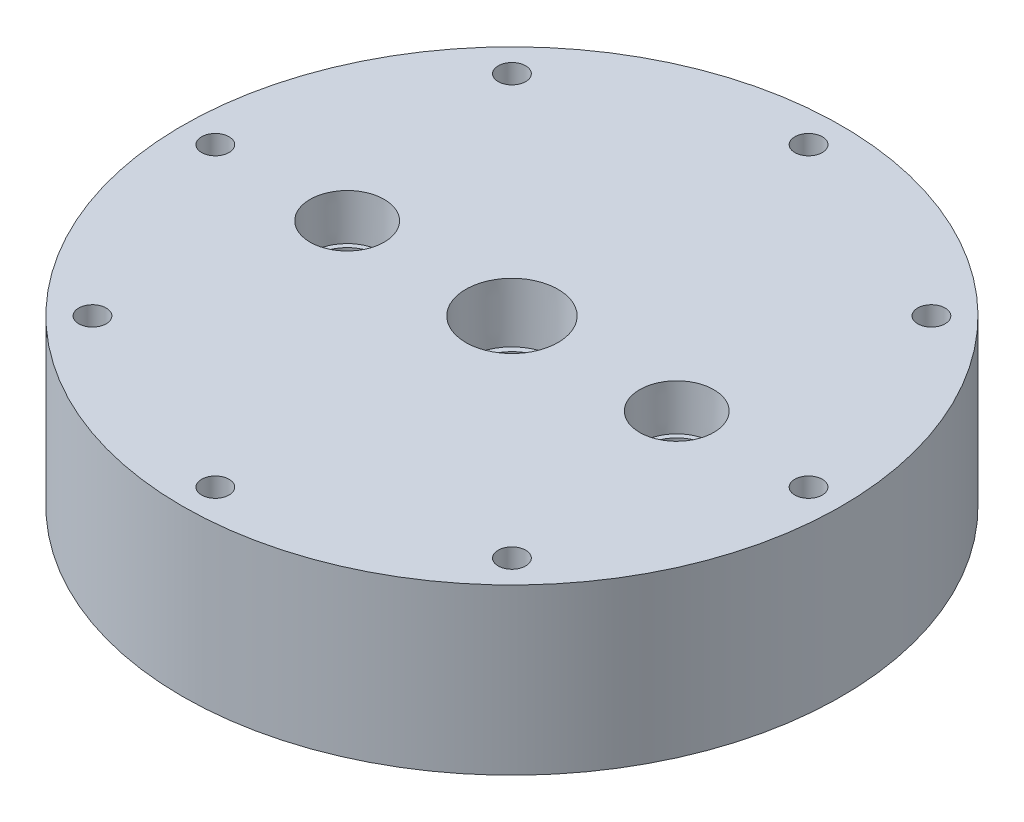
ISO-10303-21;
HEADER;
FILE_DESCRIPTION(('STEP AP214'),'2;1');
FILE_NAME('part.step','',(''),(''),'','','');
FILE_SCHEMA(('AUTOMOTIVE_DESIGN { 1 0 10303 214 1 1 1 1 }'));
ENDSEC;
DATA;
#1=APPLICATION_CONTEXT('core data for automotive mechanical design processes');
#2=APPLICATION_PROTOCOL_DEFINITION('international standard','automotive_design',2000,#1);
#3=PRODUCT_CONTEXT('',#1,'mechanical');
#4=PRODUCT('Part','Part','',(#3));
#5=PRODUCT_RELATED_PRODUCT_CATEGORY('part','',(#4));
#6=PRODUCT_DEFINITION_FORMATION('','',#4);
#7=PRODUCT_DEFINITION_CONTEXT('part definition',#1,'design');
#8=PRODUCT_DEFINITION('design','',#6,#7);
#9=PRODUCT_DEFINITION_SHAPE('','',#8);
#10=(LENGTH_UNIT() NAMED_UNIT(*) SI_UNIT(.MILLI.,.METRE.));
#11=(NAMED_UNIT(*) PLANE_ANGLE_UNIT() SI_UNIT($,.RADIAN.));
#12=(NAMED_UNIT(*) SI_UNIT($,.STERADIAN.) SOLID_ANGLE_UNIT());
#13=UNCERTAINTY_MEASURE_WITH_UNIT(LENGTH_MEASURE(1.E-05),#10,'distance_accuracy_value','');
#14=(GEOMETRIC_REPRESENTATION_CONTEXT(3) GLOBAL_UNCERTAINTY_ASSIGNED_CONTEXT((#13)) GLOBAL_UNIT_ASSIGNED_CONTEXT((#10,
#11,#12)) REPRESENTATION_CONTEXT('',''));
#15=CARTESIAN_POINT('',(0.,0.,0.));
#16=DIRECTION('',(0.,0.,1.));
#17=DIRECTION('',(1.,0.,0.));
#18=AXIS2_PLACEMENT_3D('',#15,#16,#17);
#19=CARTESIAN_POINT('',(0.,-33.02,0.));
#20=DIRECTION('',(0.,1.,0.));
#21=DIRECTION('',(0.,0.,1.));
#22=AXIS2_PLACEMENT_3D('',#19,#20,#21);
#23=PLANE('',#22);
#24=CARTESIAN_POINT('',(0.,-33.02,0.));
#25=DIRECTION('',(0.,1.,0.));
#26=DIRECTION('',(0.,0.,1.));
#27=AXIS2_PLACEMENT_3D('',#24,#25,#26);
#28=CIRCLE('',#27,22.225);
#29=CARTESIAN_POINT('',(0.,-33.02,22.225));
#30=VERTEX_POINT('',#29);
#31=EDGE_CURVE('E152',#30,#30,#28,.T.);
#32=ORIENTED_EDGE('',*,*,#31,.T.);
#33=EDGE_LOOP('',(#32));
#34=FACE_BOUND('',#33,.T.);
#35=CARTESIAN_POINT('',(0.,-33.02,0.));
#36=DIRECTION('',(0.,-1.,0.));
#37=DIRECTION('',(0.,0.,-1.));
#38=AXIS2_PLACEMENT_3D('',#35,#36,#37);
#39=CIRCLE('',#38,25.4);
#40=CARTESIAN_POINT('',(0.,-33.02,-25.4));
#41=VERTEX_POINT('',#40);
#42=EDGE_CURVE('E65',#41,#41,#39,.T.);
#43=ORIENTED_EDGE('',*,*,#42,.T.);
#44=EDGE_LOOP('',(#43));
#45=FACE_BOUND('',#44,.T.);
#46=ADVANCED_FACE('F37',(#34,#45),#23,.F.);
#47=CARTESIAN_POINT('',(0.,-33.02,0.));
#48=DIRECTION('',(0.,-1.,0.));
#49=DIRECTION('',(0.,0.,-1.));
#50=AXIS2_PLACEMENT_3D('',#47,#48,#49);
#51=CYLINDRICAL_SURFACE('',#50,28.575);
#52=CARTESIAN_POINT('',(0.,-38.1,0.));
#53=DIRECTION('',(0.,1.,0.));
#54=DIRECTION('',(0.,0.,1.));
#55=AXIS2_PLACEMENT_3D('',#52,#53,#54);
#56=CIRCLE('',#55,28.575);
#57=CARTESIAN_POINT('',(0.,-38.1,28.575));
#58=VERTEX_POINT('',#57);
#59=EDGE_CURVE('E54',#58,#58,#56,.T.);
#60=ORIENTED_EDGE('',*,*,#59,.F.);
#61=EDGE_LOOP('',(#60));
#62=FACE_BOUND('',#61,.T.);
#63=CARTESIAN_POINT('',(0.,-33.02,0.));
#64=DIRECTION('',(0.,1.,0.));
#65=DIRECTION('',(0.,0.,1.));
#66=AXIS2_PLACEMENT_3D('',#63,#64,#65);
#67=CIRCLE('',#66,28.575);
#68=CARTESIAN_POINT('',(0.,-33.02,28.575));
#69=VERTEX_POINT('',#68);
#70=EDGE_CURVE('E45',#69,#69,#67,.T.);
#71=ORIENTED_EDGE('',*,*,#70,.T.);
#72=EDGE_LOOP('',(#71));
#73=FACE_BOUND('',#72,.T.);
#74=ADVANCED_FACE('F172',(#62,#73),#51,.F.);
#75=CARTESIAN_POINT('',(0.,-33.02,0.));
#76=DIRECTION('',(0.,-1.,0.));
#77=DIRECTION('',(0.,0.,-1.));
#78=AXIS2_PLACEMENT_3D('',#75,#76,#77);
#79=CIRCLE('',#78,27.94);
#80=CARTESIAN_POINT('',(0.,-33.02,-27.94));
#81=VERTEX_POINT('',#80);
#82=EDGE_CURVE('E83',#81,#81,#79,.T.);
#83=ORIENTED_EDGE('',*,*,#82,.F.);
#84=EDGE_LOOP('',(#83));
#85=FACE_BOUND('',#84,.T.);
#86=ORIENTED_EDGE('',*,*,#70,.F.);
#87=EDGE_LOOP('',(#86));
#88=FACE_BOUND('',#87,.T.);
#89=ADVANCED_FACE('F162',(#85,#88),#23,.F.);
#90=CARTESIAN_POINT('',(0.,-28.55722,0.));
#91=DIRECTION('',(0.,-1.,0.));
#92=DIRECTION('',(0.,0.,-1.));
#93=AXIS2_PLACEMENT_3D('',#90,#91,#92);
#94=CYLINDRICAL_SURFACE('',#93,22.225);
#95=CARTESIAN_POINT('',(0.,-28.55722,0.));
#96=DIRECTION('',(0.,1.,0.));
#97=DIRECTION('',(0.,0.,1.));
#98=AXIS2_PLACEMENT_3D('',#95,#96,#97);
#99=CIRCLE('',#98,22.225);
#100=CARTESIAN_POINT('',(0.,-28.55722,22.225));
#101=VERTEX_POINT('',#100);
#102=EDGE_CURVE('E50',#101,#101,#99,.T.);
#103=ORIENTED_EDGE('',*,*,#102,.T.);
#104=EDGE_LOOP('',(#103));
#105=FACE_BOUND('',#104,.T.);
#106=ORIENTED_EDGE('',*,*,#31,.F.);
#107=EDGE_LOOP('',(#106));
#108=FACE_BOUND('',#107,.T.);
#109=ADVANCED_FACE('F159',(#105,#108),#94,.F.);
#110=CARTESIAN_POINT('',(0.,-28.55722,0.));
#111=DIRECTION('',(0.,1.,0.));
#112=DIRECTION('',(0.,0.,1.));
#113=AXIS2_PLACEMENT_3D('',#110,#111,#112);
#114=PLANE('',#113);
#115=CARTESIAN_POINT('',(0.,-28.55722,0.));
#116=DIRECTION('',(0.,1.,0.));
#117=DIRECTION('',(0.,0.,1.));
#118=AXIS2_PLACEMENT_3D('',#115,#116,#117);
#119=CIRCLE('',#118,8.9281);
#120=CARTESIAN_POINT('',(0.,-28.55722,8.9281));
#121=VERTEX_POINT('',#120);
#122=EDGE_CURVE('E59',#121,#121,#119,.T.);
#123=ORIENTED_EDGE('',*,*,#122,.T.);
#124=EDGE_LOOP('',(#123));
#125=FACE_BOUND('',#124,.T.);
#126=ORIENTED_EDGE('',*,*,#102,.F.);
#127=EDGE_LOOP('',(#126));
#128=FACE_BOUND('',#127,.T.);
#129=ADVANCED_FACE('F161',(#125,#128),#114,.F.);
#130=CARTESIAN_POINT('',(0.,-38.1,0.));
#131=DIRECTION('',(0.,-1.,0.));
#132=DIRECTION('',(0.,0.,-1.));
#133=AXIS2_PLACEMENT_3D('',#130,#131,#132);
#134=CYLINDRICAL_SURFACE('',#133,60.96);
#135=CARTESIAN_POINT('',(0.,-38.1,0.));
#136=DIRECTION('',(0.,1.,0.));
#137=DIRECTION('',(0.,0.,1.));
#138=AXIS2_PLACEMENT_3D('',#135,#136,#137);
#139=CIRCLE('',#138,60.96);
#140=CARTESIAN_POINT('',(0.,-38.1,60.96));
#141=VERTEX_POINT('',#140);
#142=EDGE_CURVE('E58',#141,#141,#139,.T.);
#143=ORIENTED_EDGE('',*,*,#142,.T.);
#144=EDGE_LOOP('',(#143));
#145=FACE_BOUND('',#144,.T.);
#146=CARTESIAN_POINT('',(0.,-50.8,0.));
#147=DIRECTION('',(0.,1.,0.));
#148=DIRECTION('',(0.,0.,1.));
#149=AXIS2_PLACEMENT_3D('',#146,#147,#148);
#150=CIRCLE('',#149,60.96);
#151=CARTESIAN_POINT('',(0.,-50.8,60.96));
#152=VERTEX_POINT('',#151);
#153=EDGE_CURVE('E61',#152,#152,#150,.T.);
#154=ORIENTED_EDGE('',*,*,#153,.F.);
#155=EDGE_LOOP('',(#154));
#156=FACE_BOUND('',#155,.T.);
#157=ADVANCED_FACE('F169',(#145,#156),#134,.F.);
#158=CARTESIAN_POINT('',(0.,-38.1,0.));
#159=DIRECTION('',(0.,1.,0.));
#160=DIRECTION('',(0.,0.,1.));
#161=AXIS2_PLACEMENT_3D('',#158,#159,#160);
#162=PLANE('',#161);
#163=CARTESIAN_POINT('',(0.,-38.1,50.8));
#164=DIRECTION('',(0.,-1.,0.));
#165=DIRECTION('',(0.,0.,-1.));
#166=AXIS2_PLACEMENT_3D('',#163,#164,#165);
#167=CIRCLE('',#166,1.190625);
#168=CARTESIAN_POINT('',(0.,-38.1,49.609375));
#169=VERTEX_POINT('',#168);
#170=EDGE_CURVE('E512',#169,#169,#167,.T.);
#171=ORIENTED_EDGE('',*,*,#170,.F.);
#172=EDGE_LOOP('',(#171));
#173=FACE_BOUND('',#172,.T.);
#174=CARTESIAN_POINT('',(0.,-38.1,-50.8));
#175=DIRECTION('',(0.,-1.,0.));
#176=DIRECTION('',(0.,0.,1.));
#177=AXIS2_PLACEMENT_3D('',#174,#175,#176);
#178=CIRCLE('',#177,1.190625);
#179=CARTESIAN_POINT('',(0.,-38.1,-49.609375));
#180=VERTEX_POINT('',#179);
#181=EDGE_CURVE('E522',#180,#180,#178,.T.);
#182=ORIENTED_EDGE('',*,*,#181,.F.);
#183=EDGE_LOOP('',(#182));
#184=FACE_BOUND('',#183,.T.);
#185=CARTESIAN_POINT('',(-38.1,-38.1,0.));
#186=DIRECTION('',(0.,1.,0.));
#187=DIRECTION('',(0.,0.,1.));
#188=AXIS2_PLACEMENT_3D('',#185,#186,#187);
#189=CIRCLE('',#188,7.1374);
#190=CARTESIAN_POINT('',(-38.1,-38.1,7.1374));
#191=VERTEX_POINT('',#190);
#192=EDGE_CURVE('E41',#191,#191,#189,.T.);
#193=ORIENTED_EDGE('',*,*,#192,.T.);
#194=EDGE_LOOP('',(#193));
#195=FACE_BOUND('',#194,.T.);
#196=CARTESIAN_POINT('',(38.1,-38.1,0.));
#197=DIRECTION('',(0.,1.,0.));
#198=DIRECTION('',(0.,0.,1.));
#199=AXIS2_PLACEMENT_3D('',#196,#197,#198);
#200=CIRCLE('',#199,7.1374);
#201=CARTESIAN_POINT('',(38.1,-38.1,7.1374));
#202=VERTEX_POINT('',#201);
#203=EDGE_CURVE('E63',#202,#202,#200,.T.);
#204=ORIENTED_EDGE('',*,*,#203,.T.);
#205=EDGE_LOOP('',(#204));
#206=FACE_BOUND('',#205,.T.);
#207=ORIENTED_EDGE('',*,*,#59,.T.);
#208=EDGE_LOOP('',(#207));
#209=FACE_BOUND('',#208,.T.);
#210=ORIENTED_EDGE('',*,*,#142,.F.);
#211=EDGE_LOOP('',(#210));
#212=FACE_BOUND('',#211,.T.);
#213=ADVANCED_FACE('F231',(#173,#184,#195,#206,#209,#212),#162,.F.);
#214=CARTESIAN_POINT('',(0.,-12.7,0.));
#215=DIRECTION('',(0.,1.,0.));
#216=DIRECTION('',(0.,0.,1.));
#217=AXIS2_PLACEMENT_3D('',#214,#215,#216);
#218=PLANE('',#217);
#219=CARTESIAN_POINT('',(-38.1,-12.7,0.));
#220=DIRECTION('',(0.,1.,0.));
#221=DIRECTION('',(0.,0.,1.));
#222=AXIS2_PLACEMENT_3D('',#219,#220,#221);
#223=CIRCLE('',#222,8.5750146);
#224=CARTESIAN_POINT('',(-38.1,-12.7,8.5750146));
#225=VERTEX_POINT('',#224);
#226=EDGE_CURVE('E241',#225,#225,#223,.T.);
#227=ORIENTED_EDGE('',*,*,#226,.F.);
#228=EDGE_LOOP('',(#227));
#229=FACE_BOUND('',#228,.T.);
#230=CARTESIAN_POINT('',(38.1,-12.7,0.));
#231=DIRECTION('',(0.,1.,0.));
#232=DIRECTION('',(0.,0.,1.));
#233=AXIS2_PLACEMENT_3D('',#230,#231,#232);
#234=CIRCLE('',#233,8.5750146);
#235=CARTESIAN_POINT('',(38.1,-12.7,8.5750146));
#236=VERTEX_POINT('',#235);
#237=EDGE_CURVE('E78',#236,#236,#234,.T.);
#238=ORIENTED_EDGE('',*,*,#237,.F.);
#239=EDGE_LOOP('',(#238));
#240=FACE_BOUND('',#239,.T.);
#241=CARTESIAN_POINT('',(0.,-12.7,0.));
#242=DIRECTION('',(0.,1.,0.));
#243=DIRECTION('',(0.,0.,1.));
#244=AXIS2_PLACEMENT_3D('',#241,#242,#243);
#245=CIRCLE('',#244,10.6647361);
#246=CARTESIAN_POINT('',(0.,-12.7,10.6647361));
#247=VERTEX_POINT('',#246);
#248=EDGE_CURVE('E88',#247,#247,#245,.T.);
#249=ORIENTED_EDGE('',*,*,#248,.F.);
#250=EDGE_LOOP('',(#249));
#251=FACE_BOUND('',#250,.T.);
#252=CARTESIAN_POINT('',(68.58,-12.7,2.41126874597481E-13));
#253=DIRECTION('',(0.,1.,0.));
#254=DIRECTION('',(0.,0.,1.));
#255=AXIS2_PLACEMENT_3D('',#252,#253,#254);
#256=CIRCLE('',#255,3.175);
#257=CARTESIAN_POINT('',(68.58,-12.7,3.17500000000024));
#258=VERTEX_POINT('',#257);
#259=EDGE_CURVE('E117',#258,#258,#256,.T.);
#260=ORIENTED_EDGE('',*,*,#259,.F.);
#261=EDGE_LOOP('',(#260));
#262=FACE_BOUND('',#261,.T.);
#263=CARTESIAN_POINT('',(48.4933830537732,-12.7,48.4933830537737));
#264=DIRECTION('',(0.,1.,0.));
#265=DIRECTION('',(0.,0.,1.));
#266=AXIS2_PLACEMENT_3D('',#263,#264,#265);
#267=CIRCLE('',#266,3.175);
#268=CARTESIAN_POINT('',(48.4933830537732,-12.7,51.6683830537737));
#269=VERTEX_POINT('',#268);
#270=EDGE_CURVE('E118',#269,#269,#267,.T.);
#271=ORIENTED_EDGE('',*,*,#270,.F.);
#272=EDGE_LOOP('',(#271));
#273=FACE_BOUND('',#272,.T.);
#274=CARTESIAN_POINT('',(0.,-12.7,68.58));
#275=DIRECTION('',(0.,1.,0.));
#276=DIRECTION('',(0.,0.,1.));
#277=AXIS2_PLACEMENT_3D('',#274,#275,#276);
#278=CIRCLE('',#277,3.175);
#279=CARTESIAN_POINT('',(0.,-12.7,71.755));
#280=VERTEX_POINT('',#279);
#281=EDGE_CURVE('E125',#280,#280,#278,.T.);
#282=ORIENTED_EDGE('',*,*,#281,.F.);
#283=EDGE_LOOP('',(#282));
#284=FACE_BOUND('',#283,.T.);
#285=CARTESIAN_POINT('',(-48.4933830537739,-12.7,48.493383053773));
#286=DIRECTION('',(0.,1.,0.));
#287=DIRECTION('',(0.,0.,1.));
#288=AXIS2_PLACEMENT_3D('',#285,#286,#287);
#289=CIRCLE('',#288,3.175);
#290=CARTESIAN_POINT('',(-48.4933830537739,-12.7,51.668383053773));
#291=VERTEX_POINT('',#290);
#292=EDGE_CURVE('E131',#291,#291,#289,.T.);
#293=ORIENTED_EDGE('',*,*,#292,.F.);
#294=EDGE_LOOP('',(#293));
#295=FACE_BOUND('',#294,.T.);
#296=CARTESIAN_POINT('',(-68.58,-12.7,-7.20018455033205E-13));
#297=DIRECTION('',(0.,1.,0.));
#298=DIRECTION('',(0.,0.,1.));
#299=AXIS2_PLACEMENT_3D('',#296,#297,#298);
#300=CIRCLE('',#299,3.175);
#301=CARTESIAN_POINT('',(-68.58,-12.7,3.17499999999928));
#302=VERTEX_POINT('',#301);
#303=EDGE_CURVE('E105',#302,#302,#300,.T.);
#304=ORIENTED_EDGE('',*,*,#303,.F.);
#305=EDGE_LOOP('',(#304));
#306=FACE_BOUND('',#305,.T.);
#307=CARTESIAN_POINT('',(-48.4933830537728,-12.7,-48.493383053774));
#308=DIRECTION('',(0.,1.,0.));
#309=DIRECTION('',(0.,0.,1.));
#310=AXIS2_PLACEMENT_3D('',#307,#308,#309);
#311=CIRCLE('',#310,3.175);
#312=CARTESIAN_POINT('',(-48.4933830537728,-12.7,-45.318383053774));
#313=VERTEX_POINT('',#312);
#314=EDGE_CURVE('E106',#313,#313,#311,.T.);
#315=ORIENTED_EDGE('',*,*,#314,.F.);
#316=EDGE_LOOP('',(#315));
#317=FACE_BOUND('',#316,.T.);
#318=CARTESIAN_POINT('',(48.4933830537735,-12.7,-48.4933830537733));
#319=DIRECTION('',(0.,1.,0.));
#320=DIRECTION('',(0.,0.,1.));
#321=AXIS2_PLACEMENT_3D('',#318,#319,#320);
#322=CIRCLE('',#321,3.175);
#323=CARTESIAN_POINT('',(48.4933830537735,-12.7,-45.3183830537734));
#324=VERTEX_POINT('',#323);
#325=EDGE_CURVE('E140',#324,#324,#322,.T.);
#326=ORIENTED_EDGE('',*,*,#325,.F.);
#327=EDGE_LOOP('',(#326));
#328=FACE_BOUND('',#327,.T.);
#329=CARTESIAN_POINT('',(0.,-12.7,-68.58));
#330=DIRECTION('',(0.,1.,0.));
#331=DIRECTION('',(0.,0.,1.));
#332=AXIS2_PLACEMENT_3D('',#329,#330,#331);
#333=CIRCLE('',#332,3.175);
#334=CARTESIAN_POINT('',(0.,-12.7,-65.405));
#335=VERTEX_POINT('',#334);
#336=EDGE_CURVE('E146',#335,#335,#333,.T.);
#337=ORIENTED_EDGE('',*,*,#336,.F.);
#338=EDGE_LOOP('',(#337));
#339=FACE_BOUND('',#338,.T.);
#340=CARTESIAN_POINT('',(0.,-12.7,0.));
#341=DIRECTION('',(0.,1.,0.));
#342=DIRECTION('',(0.,0.,1.));
#343=AXIS2_PLACEMENT_3D('',#340,#341,#342);
#344=CIRCLE('',#343,76.2);
#345=CARTESIAN_POINT('',(0.,-12.7,76.2));
#346=VERTEX_POINT('',#345);
#347=EDGE_CURVE('E149',#346,#346,#344,.T.);
#348=ORIENTED_EDGE('',*,*,#347,.T.);
#349=EDGE_LOOP('',(#348));
#350=FACE_BOUND('',#349,.T.);
#351=ADVANCED_FACE('F227',(#229,#240,#251,#262,#273,#284,#295,#306,#317,#328,#339,#350),#218,.T.);
#352=CARTESIAN_POINT('',(0.,-50.8,0.));
#353=DIRECTION('',(0.,1.,0.));
#354=DIRECTION('',(0.,0.,1.));
#355=AXIS2_PLACEMENT_3D('',#352,#353,#354);
#356=CYLINDRICAL_SURFACE('',#355,76.2);
#357=CARTESIAN_POINT('',(0.,-50.8,0.));
#358=DIRECTION('',(0.,1.,0.));
#359=DIRECTION('',(0.,0.,1.));
#360=AXIS2_PLACEMENT_3D('',#357,#358,#359);
#361=CIRCLE('',#360,76.2);
#362=CARTESIAN_POINT('',(0.,-50.8,76.2));
#363=VERTEX_POINT('',#362);
#364=EDGE_CURVE('E10',#363,#363,#361,.T.);
#365=ORIENTED_EDGE('',*,*,#364,.T.);
#366=EDGE_LOOP('',(#365));
#367=FACE_BOUND('',#366,.T.);
#368=ORIENTED_EDGE('',*,*,#347,.F.);
#369=EDGE_LOOP('',(#368));
#370=FACE_BOUND('',#369,.T.);
#371=ADVANCED_FACE('F39',(#367,#370),#356,.T.);
#372=CARTESIAN_POINT('',(0.,-12.699,-68.58));
#373=DIRECTION('',(0.,-1.,0.));
#374=DIRECTION('',(0.,0.,-1.));
#375=AXIS2_PLACEMENT_3D('',#372,#373,#374);
#376=CYLINDRICAL_SURFACE('',#375,3.175);
#377=ORIENTED_EDGE('',*,*,#336,.T.);
#378=EDGE_LOOP('',(#377));
#379=FACE_BOUND('',#378,.T.);
#380=CARTESIAN_POINT('',(0.,-50.8,-68.58));
#381=DIRECTION('',(0.,1.,0.));
#382=DIRECTION('',(0.,0.,1.));
#383=AXIS2_PLACEMENT_3D('',#380,#381,#382);
#384=CIRCLE('',#383,3.175);
#385=CARTESIAN_POINT('',(0.,-50.8,-65.405));
#386=VERTEX_POINT('',#385);
#387=EDGE_CURVE('E143',#386,#386,#384,.T.);
#388=ORIENTED_EDGE('',*,*,#387,.F.);
#389=EDGE_LOOP('',(#388));
#390=FACE_BOUND('',#389,.T.);
#391=ADVANCED_FACE('F215',(#379,#390),#376,.F.);
#392=CARTESIAN_POINT('',(48.4933830537735,-12.699,-48.4933830537733));
#393=DIRECTION('',(0.,-1.,0.));
#394=DIRECTION('',(0.,0.,-1.));
#395=AXIS2_PLACEMENT_3D('',#392,#393,#394);
#396=CYLINDRICAL_SURFACE('',#395,3.175);
#397=ORIENTED_EDGE('',*,*,#325,.T.);
#398=EDGE_LOOP('',(#397));
#399=FACE_BOUND('',#398,.T.);
#400=CARTESIAN_POINT('',(48.4933830537735,-50.8,-48.4933830537733));
#401=DIRECTION('',(0.,1.,0.));
#402=DIRECTION('',(-0.707106781186549,0.,0.707106781186546));
#403=AXIS2_PLACEMENT_3D('',#400,#401,#402);
#404=CIRCLE('',#403,3.175);
#405=CARTESIAN_POINT('',(46.2483190235062,-50.8,-46.2483190235061));
#406=VERTEX_POINT('',#405);
#407=EDGE_CURVE('E121',#406,#406,#404,.T.);
#408=ORIENTED_EDGE('',*,*,#407,.F.);
#409=EDGE_LOOP('',(#408));
#410=FACE_BOUND('',#409,.T.);
#411=ADVANCED_FACE('F217',(#399,#410),#396,.F.);
#412=CARTESIAN_POINT('',(-48.4933830537728,-12.699,-48.493383053774));
#413=DIRECTION('',(0.,-1.,0.));
#414=DIRECTION('',(0.,0.,-1.));
#415=AXIS2_PLACEMENT_3D('',#412,#413,#414);
#416=CYLINDRICAL_SURFACE('',#415,3.175);
#417=ORIENTED_EDGE('',*,*,#314,.T.);
#418=EDGE_LOOP('',(#417));
#419=FACE_BOUND('',#418,.T.);
#420=CARTESIAN_POINT('',(-48.4933830537728,-50.8,-48.493383053774));
#421=DIRECTION('',(0.,1.,0.));
#422=DIRECTION('',(0.707106781186539,0.,0.707106781186556));
#423=AXIS2_PLACEMENT_3D('',#420,#421,#422);
#424=CIRCLE('',#423,3.175);
#425=CARTESIAN_POINT('',(-46.2483190235056,-50.8,-46.2483190235067));
#426=VERTEX_POINT('',#425);
#427=EDGE_CURVE('E57',#426,#426,#424,.T.);
#428=ORIENTED_EDGE('',*,*,#427,.F.);
#429=EDGE_LOOP('',(#428));
#430=FACE_BOUND('',#429,.T.);
#431=ADVANCED_FACE('F224',(#419,#430),#416,.F.);
#432=CARTESIAN_POINT('',(-68.58,-12.699,-7.20018455033205E-13));
#433=DIRECTION('',(0.,-1.,0.));
#434=DIRECTION('',(0.,0.,-1.));
#435=AXIS2_PLACEMENT_3D('',#432,#433,#434);
#436=CYLINDRICAL_SURFACE('',#435,3.175);
#437=ORIENTED_EDGE('',*,*,#303,.T.);
#438=EDGE_LOOP('',(#437));
#439=FACE_BOUND('',#438,.T.);
#440=CARTESIAN_POINT('',(-68.58,-50.8,-7.20018455033205E-13));
#441=DIRECTION('',(0.,1.,0.));
#442=DIRECTION('',(1.,0.,0.));
#443=AXIS2_PLACEMENT_3D('',#440,#441,#442);
#444=CIRCLE('',#443,3.175);
#445=CARTESIAN_POINT('',(-65.405,-50.8,-6.86762095280724E-13));
#446=VERTEX_POINT('',#445);
#447=EDGE_CURVE('E102',#446,#446,#444,.T.);
#448=ORIENTED_EDGE('',*,*,#447,.F.);
#449=EDGE_LOOP('',(#448));
#450=FACE_BOUND('',#449,.T.);
#451=ADVANCED_FACE('F269',(#439,#450),#436,.F.);
#452=CARTESIAN_POINT('',(-48.4933830537739,-12.699,48.493383053773));
#453=DIRECTION('',(0.,-1.,0.));
#454=DIRECTION('',(0.,0.,-1.));
#455=AXIS2_PLACEMENT_3D('',#452,#453,#454);
#456=CYLINDRICAL_SURFACE('',#455,3.175);
#457=ORIENTED_EDGE('',*,*,#292,.T.);
#458=EDGE_LOOP('',(#457));
#459=FACE_BOUND('',#458,.T.);
#460=CARTESIAN_POINT('',(-48.4933830537739,-50.8,48.493383053773));
#461=DIRECTION('',(0.,1.,0.));
#462=DIRECTION('',(0.707106781186554,0.,-0.707106781186541));
#463=AXIS2_PLACEMENT_3D('',#460,#461,#462);
#464=CIRCLE('',#463,3.175);
#465=CARTESIAN_POINT('',(-46.2483190235065,-50.8,46.2483190235057));
#466=VERTEX_POINT('',#465);
#467=EDGE_CURVE('E109',#466,#466,#464,.T.);
#468=ORIENTED_EDGE('',*,*,#467,.F.);
#469=EDGE_LOOP('',(#468));
#470=FACE_BOUND('',#469,.T.);
#471=ADVANCED_FACE('F274',(#459,#470),#456,.F.);
#472=CARTESIAN_POINT('',(0.,-12.699,68.58));
#473=DIRECTION('',(0.,-1.,0.));
#474=DIRECTION('',(0.,0.,-1.));
#475=AXIS2_PLACEMENT_3D('',#472,#473,#474);
#476=CYLINDRICAL_SURFACE('',#475,3.175);
#477=ORIENTED_EDGE('',*,*,#281,.T.);
#478=EDGE_LOOP('',(#477));
#479=FACE_BOUND('',#478,.T.);
#480=CARTESIAN_POINT('',(0.,-50.8,68.58));
#481=DIRECTION('',(0.,1.,0.));
#482=DIRECTION('',(0.,0.,-1.));
#483=AXIS2_PLACEMENT_3D('',#480,#481,#482);
#484=CIRCLE('',#483,3.175);
#485=CARTESIAN_POINT('',(0.,-50.8,65.405));
#486=VERTEX_POINT('',#485);
#487=EDGE_CURVE('E128',#486,#486,#484,.T.);
#488=ORIENTED_EDGE('',*,*,#487,.F.);
#489=EDGE_LOOP('',(#488));
#490=FACE_BOUND('',#489,.T.);
#491=ADVANCED_FACE('F281',(#479,#490),#476,.F.);
#492=CARTESIAN_POINT('',(48.4933830537732,-12.699,48.4933830537737));
#493=DIRECTION('',(0.,-1.,0.));
#494=DIRECTION('',(0.,0.,-1.));
#495=AXIS2_PLACEMENT_3D('',#492,#493,#494);
#496=CYLINDRICAL_SURFACE('',#495,3.175);
#497=ORIENTED_EDGE('',*,*,#270,.T.);
#498=EDGE_LOOP('',(#497));
#499=FACE_BOUND('',#498,.T.);
#500=CARTESIAN_POINT('',(48.4933830537732,-50.8,48.4933830537737));
#501=DIRECTION('',(0.,1.,0.));
#502=DIRECTION('',(-0.707106781186544,0.,-0.707106781186551));
#503=AXIS2_PLACEMENT_3D('',#500,#501,#502);
#504=CIRCLE('',#503,3.175);
#505=CARTESIAN_POINT('',(46.2483190235059,-50.8,46.2483190235064));
#506=VERTEX_POINT('',#505);
#507=EDGE_CURVE('E122',#506,#506,#504,.T.);
#508=ORIENTED_EDGE('',*,*,#507,.F.);
#509=EDGE_LOOP('',(#508));
#510=FACE_BOUND('',#509,.T.);
#511=ADVANCED_FACE('F193',(#499,#510),#496,.F.);
#512=CARTESIAN_POINT('',(68.58,-12.699,2.41126874597481E-13));
#513=DIRECTION('',(0.,-1.,0.));
#514=DIRECTION('',(0.,0.,-1.));
#515=AXIS2_PLACEMENT_3D('',#512,#513,#514);
#516=CYLINDRICAL_SURFACE('',#515,3.175);
#517=ORIENTED_EDGE('',*,*,#259,.T.);
#518=EDGE_LOOP('',(#517));
#519=FACE_BOUND('',#518,.T.);
#520=CARTESIAN_POINT('',(68.58,-50.8,2.41126874597481E-13));
#521=DIRECTION('',(0.,1.,0.));
#522=DIRECTION('',(-1.,0.,0.));
#523=AXIS2_PLACEMENT_3D('',#520,#521,#522);
#524=CIRCLE('',#523,3.175);
#525=CARTESIAN_POINT('',(65.405,-50.8,2.30041421346654E-13));
#526=VERTEX_POINT('',#525);
#527=EDGE_CURVE('E114',#526,#526,#524,.T.);
#528=ORIENTED_EDGE('',*,*,#527,.F.);
#529=EDGE_LOOP('',(#528));
#530=FACE_BOUND('',#529,.T.);
#531=ADVANCED_FACE('F184',(#519,#530),#516,.F.);
#532=CARTESIAN_POINT('',(0.,-50.8,0.));
#533=DIRECTION('',(0.,1.,0.));
#534=DIRECTION('',(0.,0.,1.));
#535=AXIS2_PLACEMENT_3D('',#532,#533,#534);
#536=PLANE('',#535);
#537=ORIENTED_EDGE('',*,*,#153,.T.);
#538=EDGE_LOOP('',(#537));
#539=FACE_BOUND('',#538,.T.);
#540=ORIENTED_EDGE('',*,*,#527,.T.);
#541=EDGE_LOOP('',(#540));
#542=FACE_BOUND('',#541,.T.);
#543=ORIENTED_EDGE('',*,*,#507,.T.);
#544=EDGE_LOOP('',(#543));
#545=FACE_BOUND('',#544,.T.);
#546=ORIENTED_EDGE('',*,*,#487,.T.);
#547=EDGE_LOOP('',(#546));
#548=FACE_BOUND('',#547,.T.);
#549=ORIENTED_EDGE('',*,*,#467,.T.);
#550=EDGE_LOOP('',(#549));
#551=FACE_BOUND('',#550,.T.);
#552=ORIENTED_EDGE('',*,*,#447,.T.);
#553=EDGE_LOOP('',(#552));
#554=FACE_BOUND('',#553,.T.);
#555=ORIENTED_EDGE('',*,*,#427,.T.);
#556=EDGE_LOOP('',(#555));
#557=FACE_BOUND('',#556,.T.);
#558=ORIENTED_EDGE('',*,*,#407,.T.);
#559=EDGE_LOOP('',(#558));
#560=FACE_BOUND('',#559,.T.);
#561=ORIENTED_EDGE('',*,*,#387,.T.);
#562=EDGE_LOOP('',(#561));
#563=FACE_BOUND('',#562,.T.);
#564=ORIENTED_EDGE('',*,*,#364,.F.);
#565=EDGE_LOOP('',(#564));
#566=FACE_BOUND('',#565,.T.);
#567=ADVANCED_FACE('F181',(#539,#542,#545,#548,#551,#554,#557,#560,#563,#566),#536,.F.);
#568=CARTESIAN_POINT('',(0.,-12.7,0.));
#569=DIRECTION('',(0.,1.,0.));
#570=DIRECTION('',(0.,0.,1.));
#571=AXIS2_PLACEMENT_3D('',#568,#569,#570);
#572=CYLINDRICAL_SURFACE('',#571,8.9281);
#573=CARTESIAN_POINT('',(0.,-26.162,0.));
#574=DIRECTION('',(0.,1.,0.));
#575=DIRECTION('',(0.,0.,1.));
#576=AXIS2_PLACEMENT_3D('',#573,#574,#575);
#577=CIRCLE('',#576,8.9281);
#578=CARTESIAN_POINT('',(0.,-26.162,8.9281));
#579=VERTEX_POINT('',#578);
#580=EDGE_CURVE('E62',#579,#579,#577,.T.);
#581=ORIENTED_EDGE('',*,*,#580,.T.);
#582=EDGE_LOOP('',(#581));
#583=FACE_BOUND('',#582,.T.);
#584=ORIENTED_EDGE('',*,*,#122,.F.);
#585=EDGE_LOOP('',(#584));
#586=FACE_BOUND('',#585,.T.);
#587=ADVANCED_FACE('F183',(#583,#586),#572,.F.);
#588=CARTESIAN_POINT('',(8.92810000000001,-26.162,0.));
#589=DIRECTION('',(0.,-1.,0.));
#590=DIRECTION('',(0.,0.,-1.));
#591=AXIS2_PLACEMENT_3D('',#588,#589,#590);
#592=PLANE('',#591);
#593=ORIENTED_EDGE('',*,*,#580,.F.);
#594=EDGE_LOOP('',(#593));
#595=FACE_BOUND('',#594,.T.);
#596=CARTESIAN_POINT('',(0.,-26.162,0.));
#597=DIRECTION('',(0.,1.,0.));
#598=DIRECTION('',(0.,0.,1.));
#599=AXIS2_PLACEMENT_3D('',#596,#597,#598);
#600=CIRCLE('',#599,10.2616657920863);
#601=CARTESIAN_POINT('',(0.,-26.162,10.2616657920863));
#602=VERTEX_POINT('',#601);
#603=EDGE_CURVE('E93',#602,#602,#600,.T.);
#604=ORIENTED_EDGE('',*,*,#603,.T.);
#605=EDGE_LOOP('',(#604));
#606=FACE_BOUND('',#605,.T.);
#607=ADVANCED_FACE('F190',(#595,#606),#592,.F.);
#608=CARTESIAN_POINT('',(0.,-12.7,0.));
#609=DIRECTION('',(0.,1.,0.));
#610=DIRECTION('',(0.,0.,1.));
#611=AXIS2_PLACEMENT_3D('',#608,#609,#610);
#612=CONICAL_SURFACE('',#611,10.6647361,0.0299323966717032);
#613=ORIENTED_EDGE('',*,*,#603,.F.);
#614=EDGE_LOOP('',(#613));
#615=FACE_BOUND('',#614,.T.);
#616=ORIENTED_EDGE('',*,*,#248,.T.);
#617=EDGE_LOOP('',(#616));
#618=FACE_BOUND('',#617,.T.);
#619=ADVANCED_FACE('F347',(#615,#618),#612,.F.);
#620=CARTESIAN_POINT('',(0.,-30.988,0.));
#621=DIRECTION('',(0.,-1.,0.));
#622=DIRECTION('',(0.,0.,-1.));
#623=AXIS2_PLACEMENT_3D('',#620,#621,#622);
#624=CYLINDRICAL_SURFACE('',#623,27.94);
#625=CARTESIAN_POINT('',(0.,-30.988,0.));
#626=DIRECTION('',(0.,-1.,0.));
#627=DIRECTION('',(0.,0.,-1.));
#628=AXIS2_PLACEMENT_3D('',#625,#626,#627);
#629=CIRCLE('',#628,27.94);
#630=CARTESIAN_POINT('',(0.,-30.988,-27.94));
#631=VERTEX_POINT('',#630);
#632=EDGE_CURVE('E85',#631,#631,#629,.T.);
#633=ORIENTED_EDGE('',*,*,#632,.F.);
#634=EDGE_LOOP('',(#633));
#635=FACE_BOUND('',#634,.T.);
#636=ORIENTED_EDGE('',*,*,#82,.T.);
#637=EDGE_LOOP('',(#636));
#638=FACE_BOUND('',#637,.T.);
#639=ADVANCED_FACE('F356',(#635,#638),#624,.F.);
#640=CARTESIAN_POINT('',(0.,-30.988,0.));
#641=DIRECTION('',(0.,-1.,0.));
#642=DIRECTION('',(0.,0.,-1.));
#643=AXIS2_PLACEMENT_3D('',#640,#641,#642);
#644=PLANE('',#643);
#645=CARTESIAN_POINT('',(0.,-30.988,0.));
#646=DIRECTION('',(0.,-1.,0.));
#647=DIRECTION('',(0.,0.,-1.));
#648=AXIS2_PLACEMENT_3D('',#645,#646,#647);
#649=CIRCLE('',#648,25.4);
#650=CARTESIAN_POINT('',(0.,-30.988,-25.4));
#651=VERTEX_POINT('',#650);
#652=EDGE_CURVE('E70',#651,#651,#649,.T.);
#653=ORIENTED_EDGE('',*,*,#652,.F.);
#654=EDGE_LOOP('',(#653));
#655=FACE_BOUND('',#654,.T.);
#656=ORIENTED_EDGE('',*,*,#632,.T.);
#657=EDGE_LOOP('',(#656));
#658=FACE_BOUND('',#657,.T.);
#659=ADVANCED_FACE('F376',(#655,#658),#644,.T.);
#660=CARTESIAN_POINT('',(0.,-30.988,0.));
#661=DIRECTION('',(0.,-1.,0.));
#662=DIRECTION('',(0.,0.,-1.));
#663=AXIS2_PLACEMENT_3D('',#660,#661,#662);
#664=CYLINDRICAL_SURFACE('',#663,25.4);
#665=ORIENTED_EDGE('',*,*,#652,.T.);
#666=EDGE_LOOP('',(#665));
#667=FACE_BOUND('',#666,.T.);
#668=ORIENTED_EDGE('',*,*,#42,.F.);
#669=EDGE_LOOP('',(#668));
#670=FACE_BOUND('',#669,.T.);
#671=ADVANCED_FACE('F386',(#667,#670),#664,.T.);
#672=CARTESIAN_POINT('',(38.1,-12.7,0.));
#673=DIRECTION('',(0.,1.,0.));
#674=DIRECTION('',(0.,0.,1.));
#675=AXIS2_PLACEMENT_3D('',#672,#673,#674);
#676=CYLINDRICAL_SURFACE('',#675,7.1374);
#677=CARTESIAN_POINT('',(38.1,-23.114,0.));
#678=DIRECTION('',(0.,1.,0.));
#679=DIRECTION('',(0.,0.,1.));
#680=AXIS2_PLACEMENT_3D('',#677,#678,#679);
#681=CIRCLE('',#680,7.1374);
#682=CARTESIAN_POINT('',(38.1,-23.114,7.1374));
#683=VERTEX_POINT('',#682);
#684=EDGE_CURVE('E66',#683,#683,#681,.T.);
#685=ORIENTED_EDGE('',*,*,#684,.T.);
#686=EDGE_LOOP('',(#685));
#687=FACE_BOUND('',#686,.T.);
#688=ORIENTED_EDGE('',*,*,#203,.F.);
#689=EDGE_LOOP('',(#688));
#690=FACE_BOUND('',#689,.T.);
#691=ADVANCED_FACE('F395',(#687,#690),#676,.F.);
#692=CARTESIAN_POINT('',(45.2374,-23.114,0.));
#693=DIRECTION('',(0.,-1.,0.));
#694=DIRECTION('',(0.,0.,-1.));
#695=AXIS2_PLACEMENT_3D('',#692,#693,#694);
#696=PLANE('',#695);
#697=ORIENTED_EDGE('',*,*,#684,.F.);
#698=EDGE_LOOP('',(#697));
#699=FACE_BOUND('',#698,.T.);
#700=CARTESIAN_POINT('',(38.1,-23.114,0.));
#701=DIRECTION('',(0.,1.,0.));
#702=DIRECTION('',(0.,0.,1.));
#703=AXIS2_PLACEMENT_3D('',#700,#701,#702);
#704=CIRCLE('',#703,8.26320549387809);
#705=CARTESIAN_POINT('',(38.1,-23.114,8.26320549387809));
#706=VERTEX_POINT('',#705);
#707=EDGE_CURVE('E73',#706,#706,#704,.T.);
#708=ORIENTED_EDGE('',*,*,#707,.T.);
#709=EDGE_LOOP('',(#708));
#710=FACE_BOUND('',#709,.T.);
#711=ADVANCED_FACE('F411',(#699,#710),#696,.F.);
#712=CARTESIAN_POINT('',(38.1,-12.7,0.));
#713=DIRECTION('',(0.,1.,0.));
#714=DIRECTION('',(0.,0.,1.));
#715=AXIS2_PLACEMENT_3D('',#712,#713,#714);
#716=CONICAL_SURFACE('',#715,8.5750146,0.0299323966717022);
#717=ORIENTED_EDGE('',*,*,#707,.F.);
#718=EDGE_LOOP('',(#717));
#719=FACE_BOUND('',#718,.T.);
#720=ORIENTED_EDGE('',*,*,#237,.T.);
#721=EDGE_LOOP('',(#720));
#722=FACE_BOUND('',#721,.T.);
#723=ADVANCED_FACE('F420',(#719,#722),#716,.F.);
#724=CARTESIAN_POINT('',(-38.1,-12.7,0.));
#725=DIRECTION('',(0.,1.,0.));
#726=DIRECTION('',(0.,0.,1.));
#727=AXIS2_PLACEMENT_3D('',#724,#725,#726);
#728=CYLINDRICAL_SURFACE('',#727,7.1374);
#729=CARTESIAN_POINT('',(-38.1,-23.114,0.));
#730=DIRECTION('',(0.,1.,0.));
#731=DIRECTION('',(0.,0.,1.));
#732=AXIS2_PLACEMENT_3D('',#729,#730,#731);
#733=CIRCLE('',#732,7.1374);
#734=CARTESIAN_POINT('',(-38.1,-23.114,7.1374));
#735=VERTEX_POINT('',#734);
#736=EDGE_CURVE('E527',#735,#735,#733,.T.);
#737=ORIENTED_EDGE('',*,*,#736,.T.);
#738=EDGE_LOOP('',(#737));
#739=FACE_BOUND('',#738,.T.);
#740=ORIENTED_EDGE('',*,*,#192,.F.);
#741=EDGE_LOOP('',(#740));
#742=FACE_BOUND('',#741,.T.);
#743=ADVANCED_FACE('F430',(#739,#742),#728,.F.);
#744=CARTESIAN_POINT('',(-30.9626,-23.114,0.));
#745=DIRECTION('',(0.,-1.,0.));
#746=DIRECTION('',(0.,0.,-1.));
#747=AXIS2_PLACEMENT_3D('',#744,#745,#746);
#748=PLANE('',#747);
#749=ORIENTED_EDGE('',*,*,#736,.F.);
#750=EDGE_LOOP('',(#749));
#751=FACE_BOUND('',#750,.T.);
#752=CARTESIAN_POINT('',(-38.1,-23.114,0.));
#753=DIRECTION('',(0.,1.,0.));
#754=DIRECTION('',(0.,0.,1.));
#755=AXIS2_PLACEMENT_3D('',#752,#753,#754);
#756=CIRCLE('',#755,8.26320549387809);
#757=CARTESIAN_POINT('',(-38.1,-23.114,8.26320549387809));
#758=VERTEX_POINT('',#757);
#759=EDGE_CURVE('E514',#758,#758,#756,.T.);
#760=ORIENTED_EDGE('',*,*,#759,.T.);
#761=EDGE_LOOP('',(#760));
#762=FACE_BOUND('',#761,.T.);
#763=ADVANCED_FACE('F440',(#751,#762),#748,.F.);
#764=CARTESIAN_POINT('',(-38.1,-12.7,0.));
#765=DIRECTION('',(0.,1.,0.));
#766=DIRECTION('',(0.,0.,1.));
#767=AXIS2_PLACEMENT_3D('',#764,#765,#766);
#768=CONICAL_SURFACE('',#767,8.5750146,0.0299323966717026);
#769=ORIENTED_EDGE('',*,*,#759,.F.);
#770=EDGE_LOOP('',(#769));
#771=FACE_BOUND('',#770,.T.);
#772=ORIENTED_EDGE('',*,*,#226,.T.);
#773=EDGE_LOOP('',(#772));
#774=FACE_BOUND('',#773,.T.);
#775=ADVANCED_FACE('F450',(#771,#774),#768,.F.);
#776=CARTESIAN_POINT('',(0.,-34.925,-50.8));
#777=DIRECTION('',(0.,-1.,0.));
#778=DIRECTION('',(0.,0.,-1.));
#779=AXIS2_PLACEMENT_3D('',#776,#777,#778);
#780=CYLINDRICAL_SURFACE('',#779,1.190625);
#781=CARTESIAN_POINT('',(0.,-34.925,-50.8));
#782=DIRECTION('',(0.,-1.,0.));
#783=DIRECTION('',(0.,0.,1.));
#784=AXIS2_PLACEMENT_3D('',#781,#782,#783);
#785=CIRCLE('',#784,1.190625);
#786=CARTESIAN_POINT('',(0.,-34.925,-49.609375));
#787=VERTEX_POINT('',#786);
#788=EDGE_CURVE('E517',#787,#787,#785,.T.);
#789=ORIENTED_EDGE('',*,*,#788,.F.);
#790=EDGE_LOOP('',(#789));
#791=FACE_BOUND('',#790,.T.);
#792=ORIENTED_EDGE('',*,*,#181,.T.);
#793=EDGE_LOOP('',(#792));
#794=FACE_BOUND('',#793,.T.);
#795=ADVANCED_FACE('F460',(#791,#794),#780,.F.);
#796=CARTESIAN_POINT('',(0.,-34.925,-50.8));
#797=DIRECTION('',(0.,1.,0.));
#798=DIRECTION('',(0.,0.,1.));
#799=AXIS2_PLACEMENT_3D('',#796,#797,#798);
#800=PLANE('',#799);
#801=ORIENTED_EDGE('',*,*,#788,.T.);
#802=EDGE_LOOP('',(#801));
#803=FACE_BOUND('',#802,.T.);
#804=ADVANCED_FACE('F475',(#803),#800,.F.);
#805=CARTESIAN_POINT('',(0.,-34.925,50.8));
#806=DIRECTION('',(0.,-1.,0.));
#807=DIRECTION('',(0.,0.,-1.));
#808=AXIS2_PLACEMENT_3D('',#805,#806,#807);
#809=CYLINDRICAL_SURFACE('',#808,1.190625);
#810=CARTESIAN_POINT('',(0.,-34.925,50.8));
#811=DIRECTION('',(0.,-1.,0.));
#812=DIRECTION('',(0.,0.,-1.));
#813=AXIS2_PLACEMENT_3D('',#810,#811,#812);
#814=CIRCLE('',#813,1.190625);
#815=CARTESIAN_POINT('',(0.,-34.925,49.609375));
#816=VERTEX_POINT('',#815);
#817=EDGE_CURVE('E511',#816,#816,#814,.T.);
#818=ORIENTED_EDGE('',*,*,#817,.F.);
#819=EDGE_LOOP('',(#818));
#820=FACE_BOUND('',#819,.T.);
#821=ORIENTED_EDGE('',*,*,#170,.T.);
#822=EDGE_LOOP('',(#821));
#823=FACE_BOUND('',#822,.T.);
#824=ADVANCED_FACE('F485',(#820,#823),#809,.F.);
#825=CARTESIAN_POINT('',(0.,-34.925,50.8));
#826=DIRECTION('',(0.,-1.,0.));
#827=DIRECTION('',(0.,0.,-1.));
#828=AXIS2_PLACEMENT_3D('',#825,#826,#827);
#829=PLANE('',#828);
#830=ORIENTED_EDGE('',*,*,#817,.T.);
#831=EDGE_LOOP('',(#830));
#832=FACE_BOUND('',#831,.T.);
#833=ADVANCED_FACE('F495',(#832),#829,.T.);
#834=CLOSED_SHELL('',(#46,#74,#89,#109,#129,#157,#213,#351,#371,#391,#411,#431,#451,#471,#491,
#511,#531,#567,#587,#607,#619,#639,#659,#671,#691,#711,#723,#743,#763,#775,#795,#804,#824,#833));
#835=MANIFOLD_SOLID_BREP('B2',#834);
#836=ADVANCED_BREP_SHAPE_REPRESENTATION('',(#18,#835),#14);
#837=SHAPE_DEFINITION_REPRESENTATION(#9,#836);
ENDSEC;
END-ISO-10303-21;
